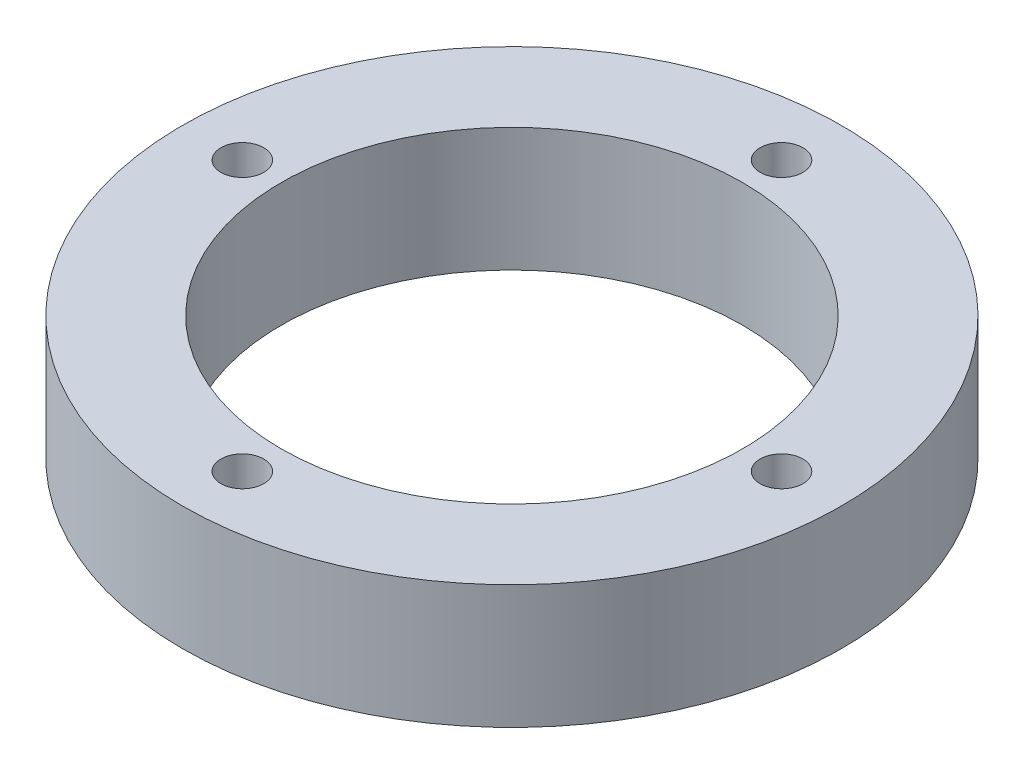
ISO-10303-21;
HEADER;
FILE_DESCRIPTION(('STEP AP214'),'2;1');
FILE_NAME('part.step','',(''),(''),'','','');
FILE_SCHEMA(('AUTOMOTIVE_DESIGN { 1 0 10303 214 1 1 1 1 }'));
ENDSEC;
DATA;
#1=APPLICATION_CONTEXT('core data for automotive mechanical design processes');
#2=APPLICATION_PROTOCOL_DEFINITION('international standard','automotive_design',2000,#1);
#3=PRODUCT_CONTEXT('',#1,'mechanical');
#4=PRODUCT('Part','Part','',(#3));
#5=PRODUCT_RELATED_PRODUCT_CATEGORY('part','',(#4));
#6=PRODUCT_DEFINITION_FORMATION('','',#4);
#7=PRODUCT_DEFINITION_CONTEXT('part definition',#1,'design');
#8=PRODUCT_DEFINITION('design','',#6,#7);
#9=PRODUCT_DEFINITION_SHAPE('','',#8);
#10=(LENGTH_UNIT() NAMED_UNIT(*) SI_UNIT(.MILLI.,.METRE.));
#11=(NAMED_UNIT(*) PLANE_ANGLE_UNIT() SI_UNIT($,.RADIAN.));
#12=(NAMED_UNIT(*) SI_UNIT($,.STERADIAN.) SOLID_ANGLE_UNIT());
#13=UNCERTAINTY_MEASURE_WITH_UNIT(LENGTH_MEASURE(1.E-05),#10,'distance_accuracy_value','');
#14=(GEOMETRIC_REPRESENTATION_CONTEXT(3) GLOBAL_UNCERTAINTY_ASSIGNED_CONTEXT((#13)) GLOBAL_UNIT_ASSIGNED_CONTEXT((#10,
#11,#12)) REPRESENTATION_CONTEXT('',''));
#15=CARTESIAN_POINT('',(0.,0.,0.));
#16=DIRECTION('',(0.,0.,1.));
#17=DIRECTION('',(1.,0.,0.));
#18=AXIS2_PLACEMENT_3D('',#15,#16,#17);
#19=CARTESIAN_POINT('',(0.,9.525,0.));
#20=DIRECTION('',(0.,1.,0.));
#21=DIRECTION('',(0.,0.,1.));
#22=AXIS2_PLACEMENT_3D('',#19,#20,#21);
#23=PLANE('',#22);
#24=CARTESIAN_POINT('',(20.7772,9.525,0.));
#25=DIRECTION('',(0.,1.,0.));
#26=DIRECTION('',(0.,0.,1.));
#27=AXIS2_PLACEMENT_3D('',#24,#25,#26);
#28=CIRCLE('',#27,1.651);
#29=CARTESIAN_POINT('',(20.7772,9.525,1.651));
#30=VERTEX_POINT('',#29);
#31=EDGE_CURVE('E59',#30,#30,#28,.T.);
#32=ORIENTED_EDGE('',*,*,#31,.F.);
#33=EDGE_LOOP('',(#32));
#34=FACE_BOUND('',#33,.T.);
#35=CARTESIAN_POINT('',(0.,9.525,-20.7772));
#36=DIRECTION('',(0.,1.,0.));
#37=DIRECTION('',(0.,0.,1.));
#38=AXIS2_PLACEMENT_3D('',#35,#36,#37);
#39=CIRCLE('',#38,1.651);
#40=CARTESIAN_POINT('',(0.,9.525,-19.1262));
#41=VERTEX_POINT('',#40);
#42=EDGE_CURVE('E47',#41,#41,#39,.T.);
#43=ORIENTED_EDGE('',*,*,#42,.F.);
#44=EDGE_LOOP('',(#43));
#45=FACE_BOUND('',#44,.T.);
#46=CARTESIAN_POINT('',(0.,9.525,0.));
#47=DIRECTION('',(0.,1.,0.));
#48=DIRECTION('',(0.,0.,1.));
#49=AXIS2_PLACEMENT_3D('',#46,#47,#48);
#50=CIRCLE('',#49,25.4);
#51=CARTESIAN_POINT('',(0.,9.525,25.4));
#52=VERTEX_POINT('',#51);
#53=EDGE_CURVE('E10',#52,#52,#50,.T.);
#54=ORIENTED_EDGE('',*,*,#53,.T.);
#55=EDGE_LOOP('',(#54));
#56=FACE_BOUND('',#55,.T.);
#57=CARTESIAN_POINT('',(0.,9.525,0.));
#58=DIRECTION('',(0.,1.,0.));
#59=DIRECTION('',(0.,0.,1.));
#60=AXIS2_PLACEMENT_3D('',#57,#58,#59);
#61=CIRCLE('',#60,17.78);
#62=CARTESIAN_POINT('',(0.,9.525,17.78));
#63=VERTEX_POINT('',#62);
#64=EDGE_CURVE('E38',#63,#63,#61,.T.);
#65=ORIENTED_EDGE('',*,*,#64,.F.);
#66=EDGE_LOOP('',(#65));
#67=FACE_BOUND('',#66,.T.);
#68=CARTESIAN_POINT('',(0.,9.525,20.7772));
#69=DIRECTION('',(0.,1.,0.));
#70=DIRECTION('',(0.,0.,-1.));
#71=AXIS2_PLACEMENT_3D('',#68,#69,#70);
#72=CIRCLE('',#71,1.651);
#73=CARTESIAN_POINT('',(0.,9.525,19.1262));
#74=VERTEX_POINT('',#73);
#75=EDGE_CURVE('E53',#74,#74,#72,.T.);
#76=ORIENTED_EDGE('',*,*,#75,.F.);
#77=EDGE_LOOP('',(#76));
#78=FACE_BOUND('',#77,.T.);
#79=CARTESIAN_POINT('',(-20.7772,9.525,0.));
#80=DIRECTION('',(0.,1.,0.));
#81=DIRECTION('',(0.,0.,-1.));
#82=AXIS2_PLACEMENT_3D('',#79,#80,#81);
#83=CIRCLE('',#82,1.651);
#84=CARTESIAN_POINT('',(-20.7772,9.525,-1.651));
#85=VERTEX_POINT('',#84);
#86=EDGE_CURVE('E65',#85,#85,#83,.T.);
#87=ORIENTED_EDGE('',*,*,#86,.F.);
#88=EDGE_LOOP('',(#87));
#89=FACE_BOUND('',#88,.T.);
#90=ADVANCED_FACE('F27',(#34,#45,#56,#67,#78,#89),#23,.T.);
#91=CARTESIAN_POINT('',(0.,0.,0.));
#92=DIRECTION('',(0.,1.,0.));
#93=DIRECTION('',(0.,0.,1.));
#94=AXIS2_PLACEMENT_3D('',#91,#92,#93);
#95=PLANE('',#94);
#96=CARTESIAN_POINT('',(20.7772,0.,0.));
#97=DIRECTION('',(0.,1.,0.));
#98=DIRECTION('',(0.,0.,1.));
#99=AXIS2_PLACEMENT_3D('',#96,#97,#98);
#100=CIRCLE('',#99,1.651);
#101=CARTESIAN_POINT('',(20.7772,0.,1.651));
#102=VERTEX_POINT('',#101);
#103=EDGE_CURVE('E62',#102,#102,#100,.T.);
#104=ORIENTED_EDGE('',*,*,#103,.T.);
#105=EDGE_LOOP('',(#104));
#106=FACE_BOUND('',#105,.T.);
#107=CARTESIAN_POINT('',(0.,0.,-20.7772));
#108=DIRECTION('',(0.,1.,0.));
#109=DIRECTION('',(0.,0.,1.));
#110=AXIS2_PLACEMENT_3D('',#107,#108,#109);
#111=CIRCLE('',#110,1.651);
#112=CARTESIAN_POINT('',(0.,0.,-19.1262));
#113=VERTEX_POINT('',#112);
#114=EDGE_CURVE('E50',#113,#113,#111,.T.);
#115=ORIENTED_EDGE('',*,*,#114,.T.);
#116=EDGE_LOOP('',(#115));
#117=FACE_BOUND('',#116,.T.);
#118=CARTESIAN_POINT('',(0.,0.,0.));
#119=DIRECTION('',(0.,1.,0.));
#120=DIRECTION('',(0.,0.,1.));
#121=AXIS2_PLACEMENT_3D('',#118,#119,#120);
#122=CIRCLE('',#121,25.4);
#123=CARTESIAN_POINT('',(0.,0.,25.4));
#124=VERTEX_POINT('',#123);
#125=EDGE_CURVE('E34',#124,#124,#122,.T.);
#126=ORIENTED_EDGE('',*,*,#125,.F.);
#127=EDGE_LOOP('',(#126));
#128=FACE_BOUND('',#127,.T.);
#129=CARTESIAN_POINT('',(0.,0.,0.));
#130=DIRECTION('',(0.,1.,0.));
#131=DIRECTION('',(0.,0.,1.));
#132=AXIS2_PLACEMENT_3D('',#129,#130,#131);
#133=CIRCLE('',#132,17.78);
#134=CARTESIAN_POINT('',(0.,0.,17.78));
#135=VERTEX_POINT('',#134);
#136=EDGE_CURVE('E42',#135,#135,#133,.T.);
#137=ORIENTED_EDGE('',*,*,#136,.T.);
#138=EDGE_LOOP('',(#137));
#139=FACE_BOUND('',#138,.T.);
#140=CARTESIAN_POINT('',(0.,0.,20.7772));
#141=DIRECTION('',(0.,1.,0.));
#142=DIRECTION('',(0.,0.,-1.));
#143=AXIS2_PLACEMENT_3D('',#140,#141,#142);
#144=CIRCLE('',#143,1.651);
#145=CARTESIAN_POINT('',(0.,0.,19.1262));
#146=VERTEX_POINT('',#145);
#147=EDGE_CURVE('E56',#146,#146,#144,.T.);
#148=ORIENTED_EDGE('',*,*,#147,.T.);
#149=EDGE_LOOP('',(#148));
#150=FACE_BOUND('',#149,.T.);
#151=CARTESIAN_POINT('',(-20.7772,0.,0.));
#152=DIRECTION('',(0.,1.,0.));
#153=DIRECTION('',(0.,0.,-1.));
#154=AXIS2_PLACEMENT_3D('',#151,#152,#153);
#155=CIRCLE('',#154,1.651);
#156=CARTESIAN_POINT('',(-20.7772,0.,-1.651));
#157=VERTEX_POINT('',#156);
#158=EDGE_CURVE('E68',#157,#157,#155,.T.);
#159=ORIENTED_EDGE('',*,*,#158,.T.);
#160=EDGE_LOOP('',(#159));
#161=FACE_BOUND('',#160,.T.);
#162=ADVANCED_FACE('F72',(#106,#117,#128,#139,#150,#161),#95,.F.);
#163=CARTESIAN_POINT('',(0.,9.525,0.));
#164=DIRECTION('',(0.,-1.,0.));
#165=DIRECTION('',(0.,0.,-1.));
#166=AXIS2_PLACEMENT_3D('',#163,#164,#165);
#167=CYLINDRICAL_SURFACE('',#166,25.4);
#168=ORIENTED_EDGE('',*,*,#53,.F.);
#169=EDGE_LOOP('',(#168));
#170=FACE_BOUND('',#169,.T.);
#171=ORIENTED_EDGE('',*,*,#125,.T.);
#172=EDGE_LOOP('',(#171));
#173=FACE_BOUND('',#172,.T.);
#174=ADVANCED_FACE('F29',(#170,#173),#167,.T.);
#175=CARTESIAN_POINT('',(0.,9.525,0.));
#176=DIRECTION('',(0.,-1.,0.));
#177=DIRECTION('',(0.,0.,-1.));
#178=AXIS2_PLACEMENT_3D('',#175,#176,#177);
#179=CYLINDRICAL_SURFACE('',#178,17.78);
#180=ORIENTED_EDGE('',*,*,#64,.T.);
#181=EDGE_LOOP('',(#180));
#182=FACE_BOUND('',#181,.T.);
#183=ORIENTED_EDGE('',*,*,#136,.F.);
#184=EDGE_LOOP('',(#183));
#185=FACE_BOUND('',#184,.T.);
#186=ADVANCED_FACE('F95',(#182,#185),#179,.F.);
#187=CARTESIAN_POINT('',(0.,9.525,-20.7772));
#188=DIRECTION('',(0.,-1.,0.));
#189=DIRECTION('',(0.,0.,-1.));
#190=AXIS2_PLACEMENT_3D('',#187,#188,#189);
#191=CYLINDRICAL_SURFACE('',#190,1.651);
#192=ORIENTED_EDGE('',*,*,#42,.T.);
#193=EDGE_LOOP('',(#192));
#194=FACE_BOUND('',#193,.T.);
#195=ORIENTED_EDGE('',*,*,#114,.F.);
#196=EDGE_LOOP('',(#195));
#197=FACE_BOUND('',#196,.T.);
#198=ADVANCED_FACE('F98',(#194,#197),#191,.F.);
#199=CARTESIAN_POINT('',(0.,9.525,20.7772));
#200=DIRECTION('',(0.,-1.,0.));
#201=DIRECTION('',(0.,0.,-1.));
#202=AXIS2_PLACEMENT_3D('',#199,#200,#201);
#203=CYLINDRICAL_SURFACE('',#202,1.651);
#204=ORIENTED_EDGE('',*,*,#75,.T.);
#205=EDGE_LOOP('',(#204));
#206=FACE_BOUND('',#205,.T.);
#207=ORIENTED_EDGE('',*,*,#147,.F.);
#208=EDGE_LOOP('',(#207));
#209=FACE_BOUND('',#208,.T.);
#210=ADVANCED_FACE('F82',(#206,#209),#203,.F.);
#211=CARTESIAN_POINT('',(20.7772,9.525,0.));
#212=DIRECTION('',(0.,-1.,0.));
#213=DIRECTION('',(0.,0.,-1.));
#214=AXIS2_PLACEMENT_3D('',#211,#212,#213);
#215=CYLINDRICAL_SURFACE('',#214,1.651);
#216=ORIENTED_EDGE('',*,*,#31,.T.);
#217=EDGE_LOOP('',(#216));
#218=FACE_BOUND('',#217,.T.);
#219=ORIENTED_EDGE('',*,*,#103,.F.);
#220=EDGE_LOOP('',(#219));
#221=FACE_BOUND('',#220,.T.);
#222=ADVANCED_FACE('F76',(#218,#221),#215,.F.);
#223=CARTESIAN_POINT('',(-20.7772,9.525,0.));
#224=DIRECTION('',(0.,-1.,0.));
#225=DIRECTION('',(0.,0.,-1.));
#226=AXIS2_PLACEMENT_3D('',#223,#224,#225);
#227=CYLINDRICAL_SURFACE('',#226,1.651);
#228=ORIENTED_EDGE('',*,*,#86,.T.);
#229=EDGE_LOOP('',(#228));
#230=FACE_BOUND('',#229,.T.);
#231=ORIENTED_EDGE('',*,*,#158,.F.);
#232=EDGE_LOOP('',(#231));
#233=FACE_BOUND('',#232,.T.);
#234=ADVANCED_FACE('F74',(#230,#233),#227,.F.);
#235=CLOSED_SHELL('',(#90,#162,#174,#186,#198,#210,#222,#234));
#236=MANIFOLD_SOLID_BREP('B2',#235);
#237=ADVANCED_BREP_SHAPE_REPRESENTATION('',(#18,#236),#14);
#238=SHAPE_DEFINITION_REPRESENTATION(#9,#237);
ENDSEC;
END-ISO-10303-21;
